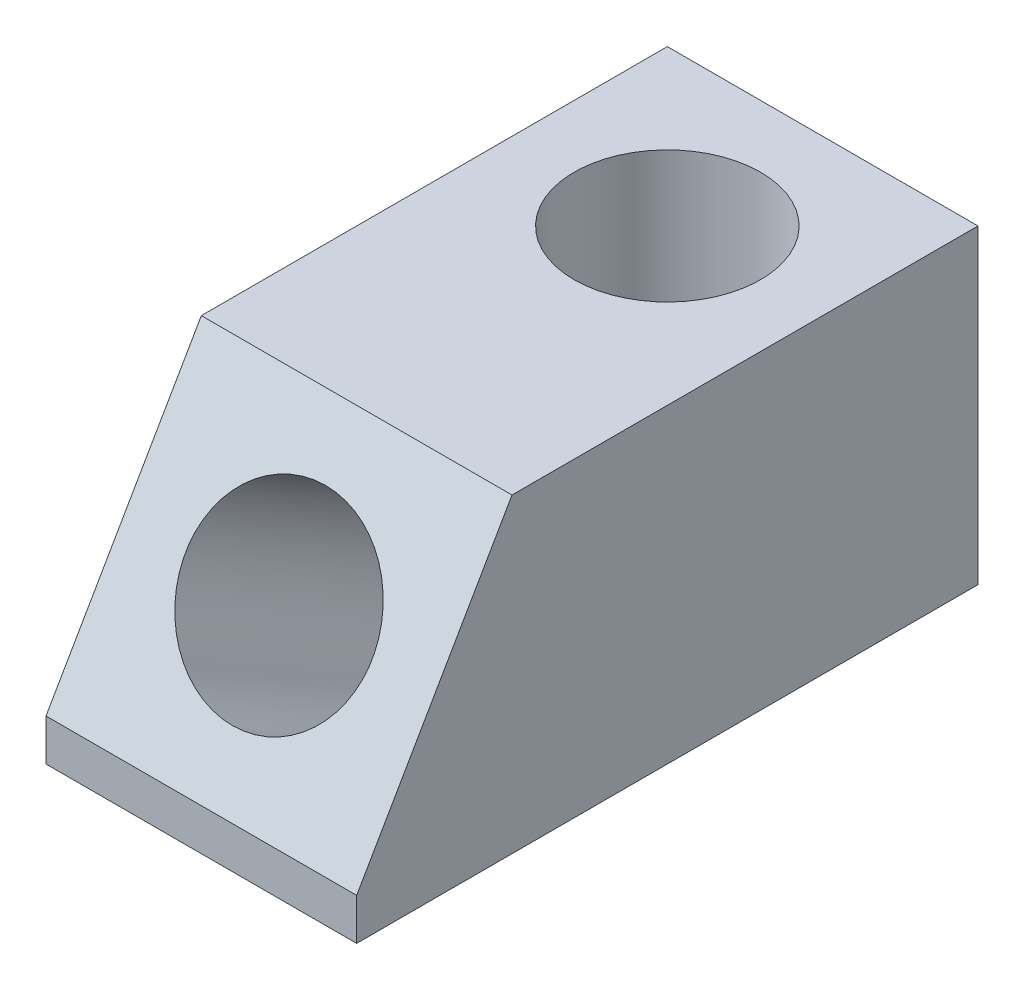
ISO-10303-21;
HEADER;
FILE_DESCRIPTION(('STEP AP214'),'2;1');
FILE_NAME('part.step','',(''),(''),'','','');
FILE_SCHEMA(('AUTOMOTIVE_DESIGN { 1 0 10303 214 1 1 1 1 }'));
ENDSEC;
DATA;
#1=APPLICATION_CONTEXT('core data for automotive mechanical design processes');
#2=APPLICATION_PROTOCOL_DEFINITION('international standard','automotive_design',2000,#1);
#3=PRODUCT_CONTEXT('',#1,'mechanical');
#4=PRODUCT('Part','Part','',(#3));
#5=PRODUCT_RELATED_PRODUCT_CATEGORY('part','',(#4));
#6=PRODUCT_DEFINITION_FORMATION('','',#4);
#7=PRODUCT_DEFINITION_CONTEXT('part definition',#1,'design');
#8=PRODUCT_DEFINITION('design','',#6,#7);
#9=PRODUCT_DEFINITION_SHAPE('','',#8);
#10=(LENGTH_UNIT() NAMED_UNIT(*) SI_UNIT(.MILLI.,.METRE.));
#11=(NAMED_UNIT(*) PLANE_ANGLE_UNIT() SI_UNIT($,.RADIAN.));
#12=(NAMED_UNIT(*) SI_UNIT($,.STERADIAN.) SOLID_ANGLE_UNIT());
#13=UNCERTAINTY_MEASURE_WITH_UNIT(LENGTH_MEASURE(1.E-05),#10,'distance_accuracy_value','');
#14=(GEOMETRIC_REPRESENTATION_CONTEXT(3) GLOBAL_UNCERTAINTY_ASSIGNED_CONTEXT((#13)) GLOBAL_UNIT_ASSIGNED_CONTEXT((#10,
#11,#12)) REPRESENTATION_CONTEXT('',''));
#15=CARTESIAN_POINT('',(0.,0.,0.));
#16=DIRECTION('',(0.,0.,1.));
#17=DIRECTION('',(1.,0.,0.));
#18=AXIS2_PLACEMENT_3D('',#15,#16,#17);
#19=CARTESIAN_POINT('',(0.,5.,0.));
#20=DIRECTION('',(0.,-1.,0.));
#21=DIRECTION('',(0.,0.,-1.));
#22=AXIS2_PLACEMENT_3D('',#19,#20,#21);
#23=PLANE('',#22);
#24=DIRECTION('',(0.,0.,1.));
#25=VECTOR('',#24,1.);
#26=CARTESIAN_POINT('',(0.,5.,0.));
#27=LINE('',#26,#25);
#28=CARTESIAN_POINT('',(0.,5.,-10.));
#29=VERTEX_POINT('',#28);
#30=CARTESIAN_POINT('',(0.,5.,-2.5));
#31=VERTEX_POINT('',#30);
#32=EDGE_CURVE('E133',#29,#31,#27,.T.);
#33=ORIENTED_EDGE('',*,*,#32,.T.);
#34=DIRECTION('',(1.,0.,0.));
#35=VECTOR('',#34,1.);
#36=CARTESIAN_POINT('',(0.,5.,-2.5));
#37=LINE('',#36,#35);
#38=CARTESIAN_POINT('',(5.,5.,-2.5));
#39=VERTEX_POINT('',#38);
#40=EDGE_CURVE('E122',#31,#39,#37,.T.);
#41=ORIENTED_EDGE('',*,*,#40,.T.);
#42=DIRECTION('',(0.,0.,-1.));
#43=VECTOR('',#42,1.);
#44=CARTESIAN_POINT('',(5.,5.,0.));
#45=LINE('',#44,#43);
#46=CARTESIAN_POINT('',(5.,5.,-10.));
#47=VERTEX_POINT('',#46);
#48=EDGE_CURVE('E137',#39,#47,#45,.T.);
#49=ORIENTED_EDGE('',*,*,#48,.T.);
#50=DIRECTION('',(-1.,0.,0.));
#51=VECTOR('',#50,1.);
#52=CARTESIAN_POINT('',(0.,5.,-10.));
#53=LINE('',#52,#51);
#54=EDGE_CURVE('E141',#47,#29,#53,.T.);
#55=ORIENTED_EDGE('',*,*,#54,.T.);
#56=EDGE_LOOP('',(#33,#41,#49,#55));
#57=FACE_BOUND('',#56,.T.);
#58=CARTESIAN_POINT('',(2.5,5.,-7.5));
#59=DIRECTION('',(0.,1.,0.));
#60=DIRECTION('',(0.,0.,1.));
#61=AXIS2_PLACEMENT_3D('',#58,#59,#60);
#62=CIRCLE('',#61,1.5);
#63=CARTESIAN_POINT('',(2.5,5.,-6.));
#64=VERTEX_POINT('',#63);
#65=EDGE_CURVE('E126',#64,#64,#62,.T.);
#66=ORIENTED_EDGE('',*,*,#65,.F.);
#67=EDGE_LOOP('',(#66));
#68=FACE_BOUND('',#67,.T.);
#69=ADVANCED_FACE('F45',(#57,#68),#23,.F.);
#70=CARTESIAN_POINT('',(0.,0.,0.));
#71=DIRECTION('',(0.,-1.,0.));
#72=DIRECTION('',(0.,0.,-1.));
#73=AXIS2_PLACEMENT_3D('',#70,#71,#72);
#74=PLANE('',#73);
#75=CARTESIAN_POINT('',(2.5,0.,-6.16025403784439));
#76=DIRECTION('',(0.,-1.,0.));
#77=DIRECTION('',(0.,0.,1.));
#78=AXIS2_PLACEMENT_3D('',#75,#76,#77);
#79=ELLIPSE('',#78,3.00000000000001,1.5);
#80=CARTESIAN_POINT('',(1.82540326350643,0.,-8.8397459621556));
#81=VERTEX_POINT('',#80);
#82=CARTESIAN_POINT('',(3.17459673649357,0.,-8.8397459621556));
#83=VERTEX_POINT('',#82);
#84=EDGE_CURVE('E67',#81,#83,#79,.T.);
#85=ORIENTED_EDGE('',*,*,#84,.F.);
#86=CARTESIAN_POINT('',(2.5,0.,-7.5));
#87=DIRECTION('',(0.,1.,0.));
#88=DIRECTION('',(0.,0.,1.));
#89=AXIS2_PLACEMENT_3D('',#86,#87,#88);
#90=CIRCLE('',#89,1.5);
#91=CARTESIAN_POINT('',(1.06802076532406,0.,-7.0534180126148));
#92=VERTEX_POINT('',#91);
#93=EDGE_CURVE('E114',#81,#92,#90,.T.);
#94=ORIENTED_EDGE('',*,*,#93,.T.);
#95=CARTESIAN_POINT('',(3.93197923467594,0.,-7.0534180126148));
#96=VERTEX_POINT('',#95);
#97=EDGE_CURVE('E60',#96,#92,#79,.T.);
#98=ORIENTED_EDGE('',*,*,#97,.F.);
#99=EDGE_CURVE('E115',#96,#83,#90,.T.);
#100=ORIENTED_EDGE('',*,*,#99,.T.);
#101=EDGE_LOOP('',(#85,#94,#98,#100));
#102=FACE_BOUND('',#101,.T.);
#103=DIRECTION('',(0.,0.,1.));
#104=VECTOR('',#103,1.);
#105=CARTESIAN_POINT('',(0.,0.,0.));
#106=LINE('',#105,#104);
#107=CARTESIAN_POINT('',(0.,0.,-10.));
#108=VERTEX_POINT('',#107);
#109=CARTESIAN_POINT('',(0.,0.,0.));
#110=VERTEX_POINT('',#109);
#111=EDGE_CURVE('E145',#108,#110,#106,.T.);
#112=ORIENTED_EDGE('',*,*,#111,.F.);
#113=DIRECTION('',(-1.,0.,0.));
#114=VECTOR('',#113,1.);
#115=CARTESIAN_POINT('',(0.,0.,-10.));
#116=LINE('',#115,#114);
#117=CARTESIAN_POINT('',(5.,0.,-10.));
#118=VERTEX_POINT('',#117);
#119=EDGE_CURVE('E138',#118,#108,#116,.T.);
#120=ORIENTED_EDGE('',*,*,#119,.F.);
#121=DIRECTION('',(0.,0.,-1.));
#122=VECTOR('',#121,1.);
#123=CARTESIAN_POINT('',(5.,0.,0.));
#124=LINE('',#123,#122);
#125=CARTESIAN_POINT('',(5.,0.,0.));
#126=VERTEX_POINT('',#125);
#127=EDGE_CURVE('E153',#126,#118,#124,.T.);
#128=ORIENTED_EDGE('',*,*,#127,.F.);
#129=DIRECTION('',(1.,0.,0.));
#130=VECTOR('',#129,1.);
#131=CARTESIAN_POINT('',(0.,0.,0.));
#132=LINE('',#131,#130);
#133=EDGE_CURVE('E149',#110,#126,#132,.T.);
#134=ORIENTED_EDGE('',*,*,#133,.F.);
#135=EDGE_LOOP('',(#112,#120,#128,#134));
#136=FACE_BOUND('',#135,.T.);
#137=ADVANCED_FACE('F112',(#102,#136),#74,.T.);
#138=CARTESIAN_POINT('',(0.,5.,0.));
#139=DIRECTION('',(1.,0.,0.));
#140=DIRECTION('',(0.,0.,-1.));
#141=AXIS2_PLACEMENT_3D('',#138,#139,#140);
#142=PLANE('',#141);
#143=DIRECTION('',(0.,-1.,0.));
#144=VECTOR('',#143,1.);
#145=CARTESIAN_POINT('',(0.,5.,0.));
#146=LINE('',#145,#144);
#147=CARTESIAN_POINT('',(0.,0.669872981077781,0.));
#148=VERTEX_POINT('',#147);
#149=EDGE_CURVE('E11',#148,#110,#146,.T.);
#150=ORIENTED_EDGE('',*,*,#149,.F.);
#151=DIRECTION('',(0.,0.86602540378444,-0.499999999999998));
#152=VECTOR('',#151,1.);
#153=CARTESIAN_POINT('',(0.,0.669872981077781,0.));
#154=LINE('',#153,#152);
#155=EDGE_CURVE('E187',#148,#31,#154,.T.);
#156=ORIENTED_EDGE('',*,*,#155,.T.);
#157=ORIENTED_EDGE('',*,*,#32,.F.);
#158=DIRECTION('',(0.,-1.,0.));
#159=VECTOR('',#158,1.);
#160=CARTESIAN_POINT('',(0.,5.,-10.));
#161=LINE('',#160,#159);
#162=EDGE_CURVE('E144',#29,#108,#161,.T.);
#163=ORIENTED_EDGE('',*,*,#162,.T.);
#164=ORIENTED_EDGE('',*,*,#111,.T.);
#165=EDGE_LOOP('',(#150,#156,#157,#163,#164));
#166=FACE_BOUND('',#165,.T.);
#167=ADVANCED_FACE('F47',(#166),#142,.F.);
#168=CARTESIAN_POINT('',(0.,5.,0.));
#169=DIRECTION('',(0.,0.,-1.));
#170=DIRECTION('',(-1.,0.,0.));
#171=AXIS2_PLACEMENT_3D('',#168,#169,#170);
#172=PLANE('',#171);
#173=DIRECTION('',(0.,-1.,0.));
#174=VECTOR('',#173,1.);
#175=CARTESIAN_POINT('',(5.,5.,0.));
#176=LINE('',#175,#174);
#177=CARTESIAN_POINT('',(5.,0.66987298107778,0.));
#178=VERTEX_POINT('',#177);
#179=EDGE_CURVE('E54',#178,#126,#176,.T.);
#180=ORIENTED_EDGE('',*,*,#179,.F.);
#181=DIRECTION('',(1.,0.,0.));
#182=VECTOR('',#181,1.);
#183=CARTESIAN_POINT('',(0.,0.669872981077781,0.));
#184=LINE('',#183,#182);
#185=EDGE_CURVE('E128',#148,#178,#184,.T.);
#186=ORIENTED_EDGE('',*,*,#185,.F.);
#187=ORIENTED_EDGE('',*,*,#149,.T.);
#188=ORIENTED_EDGE('',*,*,#133,.T.);
#189=EDGE_LOOP('',(#180,#186,#187,#188));
#190=FACE_BOUND('',#189,.T.);
#191=ADVANCED_FACE('F176',(#190),#172,.F.);
#192=CARTESIAN_POINT('',(5.,5.,0.));
#193=DIRECTION('',(-1.,0.,0.));
#194=DIRECTION('',(0.,0.,1.));
#195=AXIS2_PLACEMENT_3D('',#192,#193,#194);
#196=PLANE('',#195);
#197=ORIENTED_EDGE('',*,*,#48,.F.);
#198=DIRECTION('',(0.,0.86602540378444,-0.499999999999998));
#199=VECTOR('',#198,1.);
#200=CARTESIAN_POINT('',(5.,0.669872981077781,0.));
#201=LINE('',#200,#199);
#202=EDGE_CURVE('E172',#178,#39,#201,.T.);
#203=ORIENTED_EDGE('',*,*,#202,.F.);
#204=ORIENTED_EDGE('',*,*,#179,.T.);
#205=ORIENTED_EDGE('',*,*,#127,.T.);
#206=DIRECTION('',(0.,-1.,0.));
#207=VECTOR('',#206,1.);
#208=CARTESIAN_POINT('',(5.,5.,-10.));
#209=LINE('',#208,#207);
#210=EDGE_CURVE('E161',#47,#118,#209,.T.);
#211=ORIENTED_EDGE('',*,*,#210,.F.);
#212=EDGE_LOOP('',(#197,#203,#204,#205,#211));
#213=FACE_BOUND('',#212,.T.);
#214=ADVANCED_FACE('F169',(#213),#196,.F.);
#215=CARTESIAN_POINT('',(0.,5.,-10.));
#216=DIRECTION('',(0.,0.,1.));
#217=DIRECTION('',(1.,0.,0.));
#218=AXIS2_PLACEMENT_3D('',#215,#216,#217);
#219=PLANE('',#218);
#220=ORIENTED_EDGE('',*,*,#119,.T.);
#221=ORIENTED_EDGE('',*,*,#162,.F.);
#222=ORIENTED_EDGE('',*,*,#54,.F.);
#223=ORIENTED_EDGE('',*,*,#210,.T.);
#224=EDGE_LOOP('',(#220,#221,#222,#223));
#225=FACE_BOUND('',#224,.T.);
#226=ADVANCED_FACE('F182',(#225),#219,.F.);
#227=CARTESIAN_POINT('',(2.5,5.,-7.5));
#228=DIRECTION('',(0.,-1.,0.));
#229=DIRECTION('',(0.,0.,-1.));
#230=AXIS2_PLACEMENT_3D('',#227,#228,#229);
#231=CYLINDRICAL_SURFACE('',#230,1.5);
#232=CARTESIAN_POINT('',(2.5,-0.773502691896251,-7.5));
#233=DIRECTION('',(0.,-0.500000000000001,0.866025403784438));
#234=DIRECTION('',(0.,-0.866025403784438,-0.500000000000001));
#235=AXIS2_PLACEMENT_3D('',#232,#233,#234);
#236=ELLIPSE('',#235,2.99999999999999,1.5);
#237=EDGE_CURVE('E117',#92,#96,#236,.F.);
#238=ORIENTED_EDGE('',*,*,#237,.F.);
#239=ORIENTED_EDGE('',*,*,#93,.F.);
#240=CARTESIAN_POINT('',(2.5,-0.773502691896251,-7.5));
#241=DIRECTION('',(0.,-0.866025403784438,-0.500000000000001));
#242=DIRECTION('',(0.,-0.500000000000001,0.866025403784438));
#243=AXIS2_PLACEMENT_3D('',#240,#241,#242);
#244=ELLIPSE('',#243,1.73205080756888,1.5);
#245=EDGE_CURVE('E101',#83,#81,#244,.F.);
#246=ORIENTED_EDGE('',*,*,#245,.F.);
#247=ORIENTED_EDGE('',*,*,#99,.F.);
#248=EDGE_LOOP('',(#238,#239,#246,#247));
#249=FACE_BOUND('',#248,.T.);
#250=ORIENTED_EDGE('',*,*,#65,.T.);
#251=EDGE_LOOP('',(#250));
#252=FACE_BOUND('',#251,.T.);
#253=ADVANCED_FACE('F119',(#249,#252),#231,.F.);
#254=CARTESIAN_POINT('',(0.,0.669872981077781,0.));
#255=DIRECTION('',(0.,-0.499999999999998,-0.86602540378444));
#256=DIRECTION('',(0.,0.86602540378444,-0.499999999999998));
#257=AXIS2_PLACEMENT_3D('',#254,#255,#256);
#258=PLANE('',#257);
#259=CARTESIAN_POINT('',(2.5,2.83493649053889,-1.25));
#260=DIRECTION('',(0.,0.499999999999998,0.86602540378444));
#261=DIRECTION('',(0.,-0.86602540378444,0.499999999999998));
#262=AXIS2_PLACEMENT_3D('',#259,#260,#261);
#263=CIRCLE('',#262,1.5);
#264=CARTESIAN_POINT('',(2.5,1.53589838486223,-0.500000000000003));
#265=VERTEX_POINT('',#264);
#266=EDGE_CURVE('E108',#265,#265,#263,.T.);
#267=ORIENTED_EDGE('',*,*,#266,.F.);
#268=EDGE_LOOP('',(#267));
#269=FACE_BOUND('',#268,.T.);
#270=ORIENTED_EDGE('',*,*,#202,.T.);
#271=ORIENTED_EDGE('',*,*,#40,.F.);
#272=ORIENTED_EDGE('',*,*,#155,.F.);
#273=ORIENTED_EDGE('',*,*,#185,.T.);
#274=EDGE_LOOP('',(#270,#271,#272,#273));
#275=FACE_BOUND('',#274,.T.);
#276=ADVANCED_FACE('F191',(#269,#275),#258,.F.);
#277=CARTESIAN_POINT('',(2.5,-1.66265877365274,-9.04006350946111));
#278=DIRECTION('',(0.,0.499999999999998,0.86602540378444));
#279=DIRECTION('',(0.,-0.86602540378444,0.499999999999998));
#280=AXIS2_PLACEMENT_3D('',#277,#278,#279);
#281=CYLINDRICAL_SURFACE('',#280,1.5);
#282=ORIENTED_EDGE('',*,*,#97,.T.);
#283=ORIENTED_EDGE('',*,*,#237,.T.);
#284=EDGE_LOOP('',(#282,#283));
#285=FACE_BOUND('',#284,.T.);
#286=ORIENTED_EDGE('',*,*,#266,.T.);
#287=EDGE_LOOP('',(#286));
#288=FACE_BOUND('',#287,.T.);
#289=ADVANCED_FACE('F205',(#285,#288),#281,.F.);
#290=ORIENTED_EDGE('',*,*,#84,.T.);
#291=ORIENTED_EDGE('',*,*,#245,.T.);
#292=EDGE_LOOP('',(#290,#291));
#293=FACE_BOUND('',#292,.T.);
#294=ADVANCED_FACE('F102',(#293),#281,.F.);
#295=CLOSED_SHELL('',(#69,#137,#167,#191,#214,#226,#253,#276,#289,#294));
#296=MANIFOLD_SOLID_BREP('B2',#295);
#297=ADVANCED_BREP_SHAPE_REPRESENTATION('',(#18,#296),#14);
#298=SHAPE_DEFINITION_REPRESENTATION(#9,#297);
ENDSEC;
END-ISO-10303-21;
